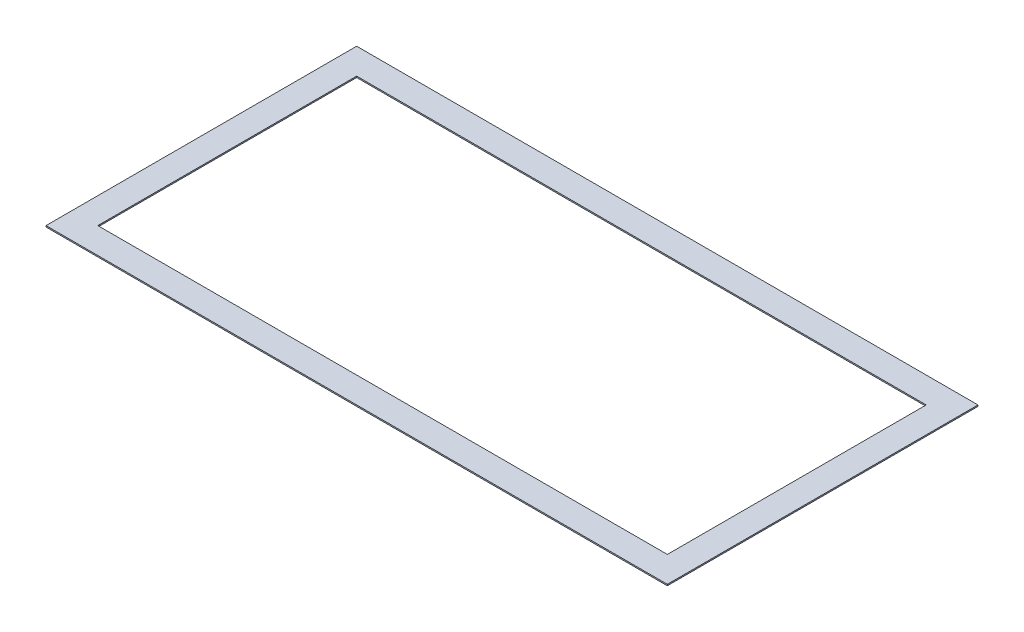
ISO-10303-21;
HEADER;
FILE_DESCRIPTION(('STEP AP214'),'2;1');
FILE_NAME('part.step','',(''),(''),'','','');
FILE_SCHEMA(('AUTOMOTIVE_DESIGN { 1 0 10303 214 1 1 1 1 }'));
ENDSEC;
DATA;
#1=APPLICATION_CONTEXT('core data for automotive mechanical design processes');
#2=APPLICATION_PROTOCOL_DEFINITION('international standard','automotive_design',2000,#1);
#3=PRODUCT_CONTEXT('',#1,'mechanical');
#4=PRODUCT('Part','Part','',(#3));
#5=PRODUCT_RELATED_PRODUCT_CATEGORY('part','',(#4));
#6=PRODUCT_DEFINITION_FORMATION('','',#4);
#7=PRODUCT_DEFINITION_CONTEXT('part definition',#1,'design');
#8=PRODUCT_DEFINITION('design','',#6,#7);
#9=PRODUCT_DEFINITION_SHAPE('','',#8);
#10=(LENGTH_UNIT() NAMED_UNIT(*) SI_UNIT(.MILLI.,.METRE.));
#11=(NAMED_UNIT(*) PLANE_ANGLE_UNIT() SI_UNIT($,.RADIAN.));
#12=(NAMED_UNIT(*) SI_UNIT($,.STERADIAN.) SOLID_ANGLE_UNIT());
#13=UNCERTAINTY_MEASURE_WITH_UNIT(LENGTH_MEASURE(1.E-05),#10,'distance_accuracy_value','');
#14=(GEOMETRIC_REPRESENTATION_CONTEXT(3) GLOBAL_UNCERTAINTY_ASSIGNED_CONTEXT((#13)) GLOBAL_UNIT_ASSIGNED_CONTEXT((#10,
#11,#12)) REPRESENTATION_CONTEXT('',''));
#15=CARTESIAN_POINT('',(0.,0.,0.));
#16=DIRECTION('',(0.,0.,1.));
#17=DIRECTION('',(1.,0.,0.));
#18=AXIS2_PLACEMENT_3D('',#15,#16,#17);
#19=CARTESIAN_POINT('',(0.,0.,0.));
#20=DIRECTION('',(0.,-1.,0.));
#21=DIRECTION('',(0.,0.,-1.));
#22=AXIS2_PLACEMENT_3D('',#19,#20,#21);
#23=PLANE('',#22);
#24=DIRECTION('',(1.,0.,0.));
#25=VECTOR('',#24,1.);
#26=CARTESIAN_POINT('',(-50.8,0.,50.8254));
#27=LINE('',#26,#25);
#28=CARTESIAN_POINT('',(-1168.4,0.,50.8254000000001));
#29=VERTEX_POINT('',#28);
#30=CARTESIAN_POINT('',(-50.8,0.,50.8254));
#31=VERTEX_POINT('',#30);
#32=EDGE_CURVE('E108',#29,#31,#27,.T.);
#33=ORIENTED_EDGE('',*,*,#32,.F.);
#34=DIRECTION('',(0.,0.,-1.));
#35=VECTOR('',#34,1.);
#36=CARTESIAN_POINT('',(-1168.4,0.,50.8254000000001));
#37=LINE('',#36,#35);
#38=CARTESIAN_POINT('',(-1168.4,0.,558.8254));
#39=VERTEX_POINT('',#38);
#40=EDGE_CURVE('E110',#39,#29,#37,.T.);
#41=ORIENTED_EDGE('',*,*,#40,.F.);
#42=DIRECTION('',(-1.,0.,0.));
#43=VECTOR('',#42,1.);
#44=CARTESIAN_POINT('',(-50.7999999999999,0.,558.8254));
#45=LINE('',#44,#43);
#46=CARTESIAN_POINT('',(-50.7999999999999,0.,558.8254));
#47=VERTEX_POINT('',#46);
#48=EDGE_CURVE('E114',#47,#39,#45,.T.);
#49=ORIENTED_EDGE('',*,*,#48,.F.);
#50=DIRECTION('',(0.,0.,1.));
#51=VECTOR('',#50,1.);
#52=CARTESIAN_POINT('',(-50.8,0.,50.8254));
#53=LINE('',#52,#51);
#54=EDGE_CURVE('E118',#31,#47,#53,.T.);
#55=ORIENTED_EDGE('',*,*,#54,.F.);
#56=EDGE_LOOP('',(#33,#41,#49,#55));
#57=FACE_BOUND('',#56,.T.);
#58=DIRECTION('',(0.,0.,-1.));
#59=VECTOR('',#58,1.);
#60=CARTESIAN_POINT('',(-1219.2,0.,0.0254000000001493));
#61=LINE('',#60,#59);
#62=CARTESIAN_POINT('',(-1219.2,0.,609.6254));
#63=VERTEX_POINT('',#62);
#64=CARTESIAN_POINT('',(-1219.2,0.,0.0254000000001493));
#65=VERTEX_POINT('',#64);
#66=EDGE_CURVE('E78',#63,#65,#61,.T.);
#67=ORIENTED_EDGE('',*,*,#66,.T.);
#68=DIRECTION('',(1.,0.,0.));
#69=VECTOR('',#68,1.);
#70=CARTESIAN_POINT('',(0.,0.,0.0254));
#71=LINE('',#70,#69);
#72=CARTESIAN_POINT('',(0.,0.,0.0254000000000373));
#73=VERTEX_POINT('',#72);
#74=EDGE_CURVE('E100',#65,#73,#71,.T.);
#75=ORIENTED_EDGE('',*,*,#74,.T.);
#76=DIRECTION('',(0.,0.,1.));
#77=VECTOR('',#76,1.);
#78=CARTESIAN_POINT('',(0.,0.,0.0254));
#79=LINE('',#78,#77);
#80=CARTESIAN_POINT('',(0.,0.,609.6254));
#81=VERTEX_POINT('',#80);
#82=EDGE_CURVE('E82',#73,#81,#79,.T.);
#83=ORIENTED_EDGE('',*,*,#82,.T.);
#84=DIRECTION('',(-1.,0.,0.));
#85=VECTOR('',#84,1.);
#86=CARTESIAN_POINT('',(0.,0.,609.6254));
#87=LINE('',#86,#85);
#88=EDGE_CURVE('E20',#81,#63,#87,.T.);
#89=ORIENTED_EDGE('',*,*,#88,.T.);
#90=EDGE_LOOP('',(#67,#75,#83,#89));
#91=FACE_BOUND('',#90,.T.);
#92=ADVANCED_FACE('F17',(#57,#91),#23,.T.);
#93=CARTESIAN_POINT('',(0.,2.54,609.6254));
#94=DIRECTION('',(0.,0.,-1.));
#95=DIRECTION('',(-1.,0.,0.));
#96=AXIS2_PLACEMENT_3D('',#93,#94,#95);
#97=PLANE('',#96);
#98=DIRECTION('',(0.,1.,0.));
#99=VECTOR('',#98,1.);
#100=CARTESIAN_POINT('',(0.,2.54,609.6254));
#101=LINE('',#100,#99);
#102=CARTESIAN_POINT('',(0.,2.54,609.6254));
#103=VERTEX_POINT('',#102);
#104=EDGE_CURVE('E102',#81,#103,#101,.T.);
#105=ORIENTED_EDGE('',*,*,#104,.T.);
#106=DIRECTION('',(1.,0.,0.));
#107=VECTOR('',#106,1.);
#108=CARTESIAN_POINT('',(0.,2.54,609.6254));
#109=LINE('',#108,#107);
#110=CARTESIAN_POINT('',(-1219.2,2.54,609.6254));
#111=VERTEX_POINT('',#110);
#112=EDGE_CURVE('E97',#103,#111,#109,.F.);
#113=ORIENTED_EDGE('',*,*,#112,.T.);
#114=DIRECTION('',(0.,1.,0.));
#115=VECTOR('',#114,1.);
#116=CARTESIAN_POINT('',(-1219.2,2.54,609.6254));
#117=LINE('',#116,#115);
#118=EDGE_CURVE('E87',#111,#63,#117,.F.);
#119=ORIENTED_EDGE('',*,*,#118,.T.);
#120=ORIENTED_EDGE('',*,*,#88,.F.);
#121=EDGE_LOOP('',(#105,#113,#119,#120));
#122=FACE_BOUND('',#121,.T.);
#123=ADVANCED_FACE('F96',(#122),#97,.F.);
#124=CARTESIAN_POINT('',(-1219.2,2.54,0.0254000000001493));
#125=DIRECTION('',(1.,0.,0.));
#126=DIRECTION('',(0.,0.,-1.));
#127=AXIS2_PLACEMENT_3D('',#124,#125,#126);
#128=PLANE('',#127);
#129=ORIENTED_EDGE('',*,*,#118,.F.);
#130=DIRECTION('',(0.,0.,-1.));
#131=VECTOR('',#130,1.);
#132=CARTESIAN_POINT('',(-1219.2,2.54,0.));
#133=LINE('',#132,#131);
#134=CARTESIAN_POINT('',(-1219.2,2.54,0.0254000000001493));
#135=VERTEX_POINT('',#134);
#136=EDGE_CURVE('E125',#111,#135,#133,.T.);
#137=ORIENTED_EDGE('',*,*,#136,.T.);
#138=DIRECTION('',(0.,1.,0.));
#139=VECTOR('',#138,1.);
#140=CARTESIAN_POINT('',(-1219.2,2.54,0.0254000000001493));
#141=LINE('',#140,#139);
#142=EDGE_CURVE('E93',#135,#65,#141,.F.);
#143=ORIENTED_EDGE('',*,*,#142,.T.);
#144=ORIENTED_EDGE('',*,*,#66,.F.);
#145=EDGE_LOOP('',(#129,#137,#143,#144));
#146=FACE_BOUND('',#145,.T.);
#147=ADVANCED_FACE('F90',(#146),#128,.F.);
#148=CARTESIAN_POINT('',(0.,2.54,0.0254));
#149=DIRECTION('',(0.,0.,1.));
#150=DIRECTION('',(1.,0.,0.));
#151=AXIS2_PLACEMENT_3D('',#148,#149,#150);
#152=PLANE('',#151);
#153=ORIENTED_EDGE('',*,*,#142,.F.);
#154=DIRECTION('',(1.,0.,0.));
#155=VECTOR('',#154,1.);
#156=CARTESIAN_POINT('',(0.,2.54,0.0254000000001493));
#157=LINE('',#156,#155);
#158=CARTESIAN_POINT('',(0.,2.54,0.0254000000000373));
#159=VERTEX_POINT('',#158);
#160=EDGE_CURVE('E127',#135,#159,#157,.T.);
#161=ORIENTED_EDGE('',*,*,#160,.T.);
#162=DIRECTION('',(0.,1.,0.));
#163=VECTOR('',#162,1.);
#164=CARTESIAN_POINT('',(0.,2.54,0.0254));
#165=LINE('',#164,#163);
#166=EDGE_CURVE('E104',#159,#73,#165,.F.);
#167=ORIENTED_EDGE('',*,*,#166,.T.);
#168=ORIENTED_EDGE('',*,*,#74,.F.);
#169=EDGE_LOOP('',(#153,#161,#167,#168));
#170=FACE_BOUND('',#169,.T.);
#171=ADVANCED_FACE('F175',(#170),#152,.F.);
#172=CARTESIAN_POINT('',(0.,2.54,0.0254));
#173=DIRECTION('',(-1.,0.,0.));
#174=DIRECTION('',(0.,0.,1.));
#175=AXIS2_PLACEMENT_3D('',#172,#173,#174);
#176=PLANE('',#175);
#177=ORIENTED_EDGE('',*,*,#166,.F.);
#178=DIRECTION('',(0.,0.,-1.));
#179=VECTOR('',#178,1.);
#180=CARTESIAN_POINT('',(0.,2.54,0.));
#181=LINE('',#180,#179);
#182=EDGE_CURVE('E130',#159,#103,#181,.F.);
#183=ORIENTED_EDGE('',*,*,#182,.T.);
#184=ORIENTED_EDGE('',*,*,#104,.F.);
#185=ORIENTED_EDGE('',*,*,#82,.F.);
#186=EDGE_LOOP('',(#177,#183,#184,#185));
#187=FACE_BOUND('',#186,.T.);
#188=ADVANCED_FACE('F172',(#187),#176,.F.);
#189=CARTESIAN_POINT('',(-50.8,2.54,50.8254));
#190=DIRECTION('',(0.,0.,1.));
#191=DIRECTION('',(1.,0.,0.));
#192=AXIS2_PLACEMENT_3D('',#189,#190,#191);
#193=PLANE('',#192);
#194=DIRECTION('',(1.,0.,0.));
#195=VECTOR('',#194,1.);
#196=CARTESIAN_POINT('',(0.,2.54,50.8254));
#197=LINE('',#196,#195);
#198=CARTESIAN_POINT('',(-50.8,2.54,50.8254));
#199=VERTEX_POINT('',#198);
#200=CARTESIAN_POINT('',(-1168.4,2.54,50.8254000000001));
#201=VERTEX_POINT('',#200);
#202=EDGE_CURVE('E133',#199,#201,#197,.F.);
#203=ORIENTED_EDGE('',*,*,#202,.T.);
#204=DIRECTION('',(0.,1.,0.));
#205=VECTOR('',#204,1.);
#206=CARTESIAN_POINT('',(-1168.4,2.54,50.8254000000001));
#207=LINE('',#206,#205);
#208=EDGE_CURVE('E112',#29,#201,#207,.T.);
#209=ORIENTED_EDGE('',*,*,#208,.F.);
#210=ORIENTED_EDGE('',*,*,#32,.T.);
#211=DIRECTION('',(0.,1.,0.));
#212=VECTOR('',#211,1.);
#213=CARTESIAN_POINT('',(-50.8,2.54,50.8254));
#214=LINE('',#213,#212);
#215=EDGE_CURVE('E121',#199,#31,#214,.F.);
#216=ORIENTED_EDGE('',*,*,#215,.F.);
#217=EDGE_LOOP('',(#203,#209,#210,#216));
#218=FACE_BOUND('',#217,.T.);
#219=ADVANCED_FACE('F154',(#218),#193,.T.);
#220=CARTESIAN_POINT('',(-1168.4,2.54,50.8254000000001));
#221=DIRECTION('',(1.,0.,0.));
#222=DIRECTION('',(0.,0.,-1.));
#223=AXIS2_PLACEMENT_3D('',#220,#221,#222);
#224=PLANE('',#223);
#225=DIRECTION('',(0.,0.,-1.));
#226=VECTOR('',#225,1.);
#227=CARTESIAN_POINT('',(-1168.4,2.54,0.));
#228=LINE('',#227,#226);
#229=CARTESIAN_POINT('',(-1168.4,2.54,558.8254));
#230=VERTEX_POINT('',#229);
#231=EDGE_CURVE('E136',#201,#230,#228,.F.);
#232=ORIENTED_EDGE('',*,*,#231,.T.);
#233=DIRECTION('',(0.,1.,0.));
#234=VECTOR('',#233,1.);
#235=CARTESIAN_POINT('',(-1168.4,2.54,558.8254));
#236=LINE('',#235,#234);
#237=EDGE_CURVE('E116',#39,#230,#236,.T.);
#238=ORIENTED_EDGE('',*,*,#237,.F.);
#239=ORIENTED_EDGE('',*,*,#40,.T.);
#240=ORIENTED_EDGE('',*,*,#208,.T.);
#241=EDGE_LOOP('',(#232,#238,#239,#240));
#242=FACE_BOUND('',#241,.T.);
#243=ADVANCED_FACE('F149',(#242),#224,.T.);
#244=CARTESIAN_POINT('',(-50.7999999999999,2.54,558.8254));
#245=DIRECTION('',(0.,0.,-1.));
#246=DIRECTION('',(-1.,0.,0.));
#247=AXIS2_PLACEMENT_3D('',#244,#245,#246);
#248=PLANE('',#247);
#249=DIRECTION('',(1.,0.,0.));
#250=VECTOR('',#249,1.);
#251=CARTESIAN_POINT('',(0.,2.54,558.8254));
#252=LINE('',#251,#250);
#253=CARTESIAN_POINT('',(-50.7999999999999,2.54,558.8254));
#254=VERTEX_POINT('',#253);
#255=EDGE_CURVE('E26',#230,#254,#252,.T.);
#256=ORIENTED_EDGE('',*,*,#255,.T.);
#257=DIRECTION('',(0.,1.,0.));
#258=VECTOR('',#257,1.);
#259=CARTESIAN_POINT('',(-50.7999999999999,2.54,558.8254));
#260=LINE('',#259,#258);
#261=EDGE_CURVE('E34',#47,#254,#260,.T.);
#262=ORIENTED_EDGE('',*,*,#261,.F.);
#263=ORIENTED_EDGE('',*,*,#48,.T.);
#264=ORIENTED_EDGE('',*,*,#237,.T.);
#265=EDGE_LOOP('',(#256,#262,#263,#264));
#266=FACE_BOUND('',#265,.T.);
#267=ADVANCED_FACE('F142',(#266),#248,.T.);
#268=CARTESIAN_POINT('',(-50.8,2.54,50.8254));
#269=DIRECTION('',(-1.,0.,0.));
#270=DIRECTION('',(0.,0.,1.));
#271=AXIS2_PLACEMENT_3D('',#268,#269,#270);
#272=PLANE('',#271);
#273=DIRECTION('',(0.,0.,-1.));
#274=VECTOR('',#273,1.);
#275=CARTESIAN_POINT('',(-50.7999999999999,2.54,0.));
#276=LINE('',#275,#274);
#277=EDGE_CURVE('E11',#254,#199,#276,.T.);
#278=ORIENTED_EDGE('',*,*,#277,.T.);
#279=ORIENTED_EDGE('',*,*,#215,.T.);
#280=ORIENTED_EDGE('',*,*,#54,.T.);
#281=ORIENTED_EDGE('',*,*,#261,.T.);
#282=EDGE_LOOP('',(#278,#279,#280,#281));
#283=FACE_BOUND('',#282,.T.);
#284=ADVANCED_FACE('F157',(#283),#272,.T.);
#285=CARTESIAN_POINT('',(0.,2.54,0.));
#286=DIRECTION('',(0.,-1.,0.));
#287=DIRECTION('',(0.,0.,-1.));
#288=AXIS2_PLACEMENT_3D('',#285,#286,#287);
#289=PLANE('',#288);
#290=ORIENTED_EDGE('',*,*,#255,.F.);
#291=ORIENTED_EDGE('',*,*,#231,.F.);
#292=ORIENTED_EDGE('',*,*,#202,.F.);
#293=ORIENTED_EDGE('',*,*,#277,.F.);
#294=EDGE_LOOP('',(#290,#291,#292,#293));
#295=FACE_BOUND('',#294,.T.);
#296=ORIENTED_EDGE('',*,*,#160,.F.);
#297=ORIENTED_EDGE('',*,*,#136,.F.);
#298=ORIENTED_EDGE('',*,*,#112,.F.);
#299=ORIENTED_EDGE('',*,*,#182,.F.);
#300=EDGE_LOOP('',(#296,#297,#298,#299));
#301=FACE_BOUND('',#300,.T.);
#302=ADVANCED_FACE('F146',(#295,#301),#289,.F.);
#303=CLOSED_SHELL('',(#92,#123,#147,#171,#188,#219,#243,#267,#284,#302));
#304=MANIFOLD_SOLID_BREP('B1',#303);
#305=ADVANCED_BREP_SHAPE_REPRESENTATION('',(#18,#304),#14);
#306=SHAPE_DEFINITION_REPRESENTATION(#9,#305);
ENDSEC;
END-ISO-10303-21;
